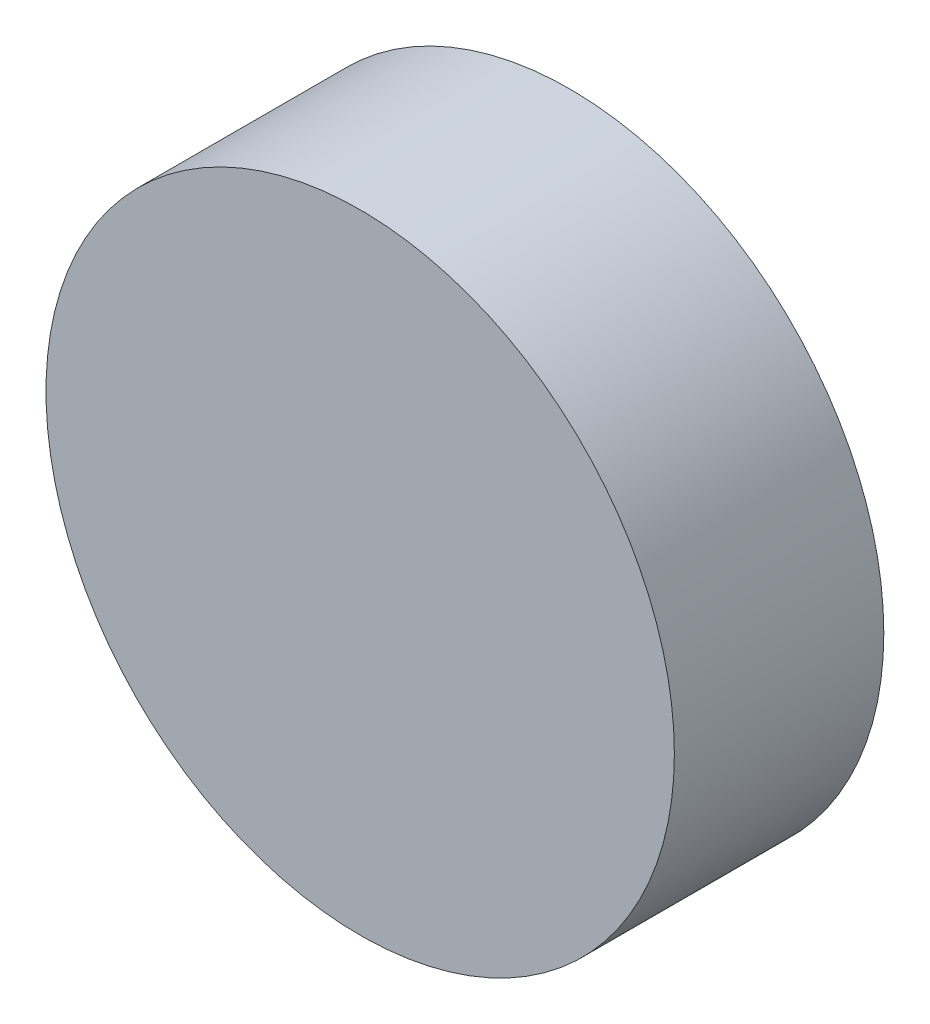
ISO-10303-21;
HEADER;
FILE_DESCRIPTION(('STEP AP214'),'2;1');
FILE_NAME('part.step','',(''),(''),'','','');
FILE_SCHEMA(('AUTOMOTIVE_DESIGN { 1 0 10303 214 1 1 1 1 }'));
ENDSEC;
DATA;
#1=APPLICATION_CONTEXT('core data for automotive mechanical design processes');
#2=APPLICATION_PROTOCOL_DEFINITION('international standard','automotive_design',2000,#1);
#3=PRODUCT_CONTEXT('',#1,'mechanical');
#4=PRODUCT('Part','Part','',(#3));
#5=PRODUCT_RELATED_PRODUCT_CATEGORY('part','',(#4));
#6=PRODUCT_DEFINITION_FORMATION('','',#4);
#7=PRODUCT_DEFINITION_CONTEXT('part definition',#1,'design');
#8=PRODUCT_DEFINITION('design','',#6,#7);
#9=PRODUCT_DEFINITION_SHAPE('','',#8);
#10=(LENGTH_UNIT() NAMED_UNIT(*) SI_UNIT(.MILLI.,.METRE.));
#11=(NAMED_UNIT(*) PLANE_ANGLE_UNIT() SI_UNIT($,.RADIAN.));
#12=(NAMED_UNIT(*) SI_UNIT($,.STERADIAN.) SOLID_ANGLE_UNIT());
#13=UNCERTAINTY_MEASURE_WITH_UNIT(LENGTH_MEASURE(1.E-05),#10,'distance_accuracy_value','');
#14=(GEOMETRIC_REPRESENTATION_CONTEXT(3) GLOBAL_UNCERTAINTY_ASSIGNED_CONTEXT((#13)) GLOBAL_UNIT_ASSIGNED_CONTEXT((#10,
#11,#12)) REPRESENTATION_CONTEXT('',''));
#15=CARTESIAN_POINT('',(0.,0.,0.));
#16=DIRECTION('',(0.,0.,1.));
#17=DIRECTION('',(1.,0.,0.));
#18=AXIS2_PLACEMENT_3D('',#15,#16,#17);
#19=CARTESIAN_POINT('',(0.,0.,4.));
#20=DIRECTION('',(0.,0.,-1.));
#21=DIRECTION('',(-1.,0.,0.));
#22=AXIS2_PLACEMENT_3D('',#19,#20,#21);
#23=CYLINDRICAL_SURFACE('',#22,6.);
#24=CARTESIAN_POINT('',(0.,0.,4.));
#25=DIRECTION('',(0.,0.,1.));
#26=DIRECTION('',(1.,0.,0.));
#27=AXIS2_PLACEMENT_3D('',#24,#25,#26);
#28=CIRCLE('',#27,6.);
#29=CARTESIAN_POINT('',(6.,0.,4.));
#30=VERTEX_POINT('',#29);
#31=EDGE_CURVE('E10',#30,#30,#28,.T.);
#32=ORIENTED_EDGE('',*,*,#31,.F.);
#33=EDGE_LOOP('',(#32));
#34=FACE_BOUND('',#33,.T.);
#35=CARTESIAN_POINT('',(0.,0.,0.));
#36=DIRECTION('',(0.,0.,1.));
#37=DIRECTION('',(1.,0.,0.));
#38=AXIS2_PLACEMENT_3D('',#35,#36,#37);
#39=CIRCLE('',#38,6.);
#40=CARTESIAN_POINT('',(6.,0.,0.));
#41=VERTEX_POINT('',#40);
#42=EDGE_CURVE('E40',#41,#41,#39,.T.);
#43=ORIENTED_EDGE('',*,*,#42,.T.);
#44=EDGE_LOOP('',(#43));
#45=FACE_BOUND('',#44,.T.);
#46=ADVANCED_FACE('F37',(#34,#45),#23,.T.);
#47=CARTESIAN_POINT('',(0.,0.,4.));
#48=DIRECTION('',(0.,0.,1.));
#49=DIRECTION('',(1.,0.,0.));
#50=AXIS2_PLACEMENT_3D('',#47,#48,#49);
#51=PLANE('',#50);
#52=ORIENTED_EDGE('',*,*,#31,.T.);
#53=EDGE_LOOP('',(#52));
#54=FACE_BOUND('',#53,.T.);
#55=ADVANCED_FACE('F54',(#54),#51,.T.);
#56=CARTESIAN_POINT('',(0.,0.,0.));
#57=DIRECTION('',(0.,0.,1.));
#58=DIRECTION('',(1.,0.,0.));
#59=AXIS2_PLACEMENT_3D('',#56,#57,#58);
#60=PLANE('',#59);
#61=ORIENTED_EDGE('',*,*,#42,.F.);
#62=EDGE_LOOP('',(#61));
#63=FACE_BOUND('',#62,.T.);
#64=ADVANCED_FACE('F52',(#63),#60,.F.);
#65=CLOSED_SHELL('',(#46,#55,#64));
#66=MANIFOLD_SOLID_BREP('B2',#65);
#67=ADVANCED_BREP_SHAPE_REPRESENTATION('',(#18,#66),#14);
#68=SHAPE_DEFINITION_REPRESENTATION(#9,#67);
ENDSEC;
END-ISO-10303-21;
